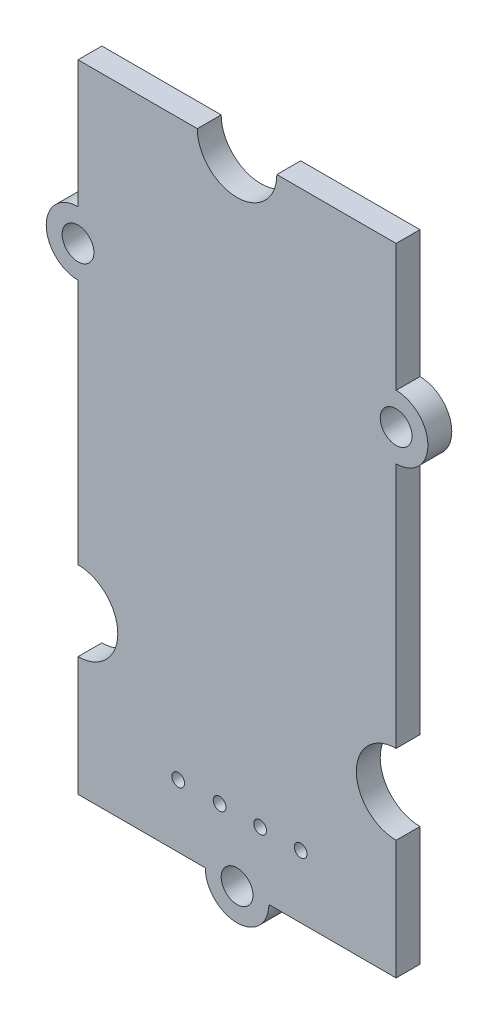
ISO-10303-21;
HEADER;
FILE_DESCRIPTION(('STEP AP214'),'2;1');
FILE_NAME('part.step','',(''),(''),'','','');
FILE_SCHEMA(('AUTOMOTIVE_DESIGN { 1 0 10303 214 1 1 1 1 }'));
ENDSEC;
DATA;
#1=APPLICATION_CONTEXT('core data for automotive mechanical design processes');
#2=APPLICATION_PROTOCOL_DEFINITION('international standard','automotive_design',2000,#1);
#3=PRODUCT_CONTEXT('',#1,'mechanical');
#4=PRODUCT('Part','Part','',(#3));
#5=PRODUCT_RELATED_PRODUCT_CATEGORY('part','',(#4));
#6=PRODUCT_DEFINITION_FORMATION('','',#4);
#7=PRODUCT_DEFINITION_CONTEXT('part definition',#1,'design');
#8=PRODUCT_DEFINITION('design','',#6,#7);
#9=PRODUCT_DEFINITION_SHAPE('','',#8);
#10=(LENGTH_UNIT() NAMED_UNIT(*) SI_UNIT(.MILLI.,.METRE.));
#11=(NAMED_UNIT(*) PLANE_ANGLE_UNIT() SI_UNIT($,.RADIAN.));
#12=(NAMED_UNIT(*) SI_UNIT($,.STERADIAN.) SOLID_ANGLE_UNIT());
#13=UNCERTAINTY_MEASURE_WITH_UNIT(LENGTH_MEASURE(1.E-05),#10,'distance_accuracy_value','');
#14=(GEOMETRIC_REPRESENTATION_CONTEXT(3) GLOBAL_UNCERTAINTY_ASSIGNED_CONTEXT((#13)) GLOBAL_UNIT_ASSIGNED_CONTEXT((#10,
#11,#12)) REPRESENTATION_CONTEXT('',''));
#15=CARTESIAN_POINT('',(0.,0.,0.));
#16=DIRECTION('',(0.,0.,1.));
#17=DIRECTION('',(1.,0.,0.));
#18=AXIS2_PLACEMENT_3D('',#15,#16,#17);
#19=CARTESIAN_POINT('',(-10.,0.,1.5));
#20=DIRECTION('',(1.,0.,0.));
#21=DIRECTION('',(0.,0.,-1.));
#22=AXIS2_PLACEMENT_3D('',#19,#20,#21);
#23=PLANE('',#22);
#24=DIRECTION('',(0.,-1.,0.));
#25=VECTOR('',#24,1.);
#26=CARTESIAN_POINT('',(-10.,0.,0.));
#27=LINE('',#26,#25);
#28=CARTESIAN_POINT('',(-10.,7.5,0.));
#29=VERTEX_POINT('',#28);
#30=CARTESIAN_POINT('',(-10.,0.,0.));
#31=VERTEX_POINT('',#30);
#32=EDGE_CURVE('E178',#29,#31,#27,.T.);
#33=ORIENTED_EDGE('',*,*,#32,.T.);
#34=DIRECTION('',(0.,0.,-1.));
#35=VECTOR('',#34,1.);
#36=CARTESIAN_POINT('',(-10.,0.,1.5));
#37=LINE('',#36,#35);
#38=CARTESIAN_POINT('',(-10.,0.,1.5));
#39=VERTEX_POINT('',#38);
#40=EDGE_CURVE('E11',#39,#31,#37,.T.);
#41=ORIENTED_EDGE('',*,*,#40,.F.);
#42=DIRECTION('',(0.,-1.,0.));
#43=VECTOR('',#42,1.);
#44=CARTESIAN_POINT('',(-10.,0.,1.5));
#45=LINE('',#44,#43);
#46=CARTESIAN_POINT('',(-10.,7.5,1.5));
#47=VERTEX_POINT('',#46);
#48=EDGE_CURVE('E209',#47,#39,#45,.T.);
#49=ORIENTED_EDGE('',*,*,#48,.F.);
#50=DIRECTION('',(0.,0.,-1.));
#51=VECTOR('',#50,1.);
#52=CARTESIAN_POINT('',(-10.,7.5,1.5));
#53=LINE('',#52,#51);
#54=EDGE_CURVE('E174',#47,#29,#53,.T.);
#55=ORIENTED_EDGE('',*,*,#54,.T.);
#56=EDGE_LOOP('',(#33,#41,#49,#55));
#57=FACE_BOUND('',#56,.T.);
#58=ADVANCED_FACE('F34',(#57),#23,.F.);
#59=CARTESIAN_POINT('',(-10.,0.,1.5));
#60=DIRECTION('',(0.,1.,0.));
#61=DIRECTION('',(0.,0.,1.));
#62=AXIS2_PLACEMENT_3D('',#59,#60,#61);
#63=PLANE('',#62);
#64=DIRECTION('',(1.,0.,0.));
#65=VECTOR('',#64,1.);
#66=CARTESIAN_POINT('',(-10.,0.,0.));
#67=LINE('',#66,#65);
#68=CARTESIAN_POINT('',(-2.,0.,0.));
#69=VERTEX_POINT('',#68);
#70=EDGE_CURVE('E181',#31,#69,#67,.T.);
#71=ORIENTED_EDGE('',*,*,#70,.T.);
#72=DIRECTION('',(0.,0.,-1.));
#73=VECTOR('',#72,1.);
#74=CARTESIAN_POINT('',(-2.,0.,1.5));
#75=LINE('',#74,#73);
#76=CARTESIAN_POINT('',(-2.,0.,1.5));
#77=VERTEX_POINT('',#76);
#78=EDGE_CURVE('E42',#77,#69,#75,.T.);
#79=ORIENTED_EDGE('',*,*,#78,.F.);
#80=DIRECTION('',(1.,0.,0.));
#81=VECTOR('',#80,1.);
#82=CARTESIAN_POINT('',(-10.,0.,1.5));
#83=LINE('',#82,#81);
#84=EDGE_CURVE('E117',#39,#77,#83,.T.);
#85=ORIENTED_EDGE('',*,*,#84,.F.);
#86=ORIENTED_EDGE('',*,*,#40,.T.);
#87=EDGE_LOOP('',(#71,#79,#85,#86));
#88=FACE_BOUND('',#87,.T.);
#89=ADVANCED_FACE('F308',(#88),#63,.F.);
#90=CARTESIAN_POINT('',(0.,0.,1.5));
#91=DIRECTION('',(0.,0.,-1.));
#92=DIRECTION('',(-1.,0.,0.));
#93=AXIS2_PLACEMENT_3D('',#90,#91,#92);
#94=CYLINDRICAL_SURFACE('',#93,2.);
#95=CARTESIAN_POINT('',(0.,0.,0.));
#96=DIRECTION('',(0.,0.,1.));
#97=DIRECTION('',(1.,0.,0.));
#98=AXIS2_PLACEMENT_3D('',#95,#96,#97);
#99=CIRCLE('',#98,2.);
#100=CARTESIAN_POINT('',(2.,0.,0.));
#101=VERTEX_POINT('',#100);
#102=EDGE_CURVE('E184',#69,#101,#99,.T.);
#103=ORIENTED_EDGE('',*,*,#102,.T.);
#104=DIRECTION('',(0.,0.,-1.));
#105=VECTOR('',#104,1.);
#106=CARTESIAN_POINT('',(2.,0.,1.5));
#107=LINE('',#106,#105);
#108=CARTESIAN_POINT('',(2.,0.,1.5));
#109=VERTEX_POINT('',#108);
#110=EDGE_CURVE('E240',#109,#101,#107,.T.);
#111=ORIENTED_EDGE('',*,*,#110,.F.);
#112=CARTESIAN_POINT('',(0.,0.,1.5));
#113=DIRECTION('',(0.,0.,1.));
#114=DIRECTION('',(1.,0.,0.));
#115=AXIS2_PLACEMENT_3D('',#112,#113,#114);
#116=CIRCLE('',#115,2.);
#117=EDGE_CURVE('E248',#77,#109,#116,.T.);
#118=ORIENTED_EDGE('',*,*,#117,.F.);
#119=ORIENTED_EDGE('',*,*,#78,.T.);
#120=EDGE_LOOP('',(#103,#111,#118,#119));
#121=FACE_BOUND('',#120,.T.);
#122=ADVANCED_FACE('F246',(#121),#94,.T.);
#123=CARTESIAN_POINT('',(10.,0.,1.5));
#124=DIRECTION('',(0.,1.,0.));
#125=DIRECTION('',(0.,0.,1.));
#126=AXIS2_PLACEMENT_3D('',#123,#124,#125);
#127=PLANE('',#126);
#128=DIRECTION('',(1.,0.,0.));
#129=VECTOR('',#128,1.);
#130=CARTESIAN_POINT('',(10.,0.,0.));
#131=LINE('',#130,#129);
#132=CARTESIAN_POINT('',(10.,0.,0.));
#133=VERTEX_POINT('',#132);
#134=EDGE_CURVE('E186',#101,#133,#131,.T.);
#135=ORIENTED_EDGE('',*,*,#134,.T.);
#136=DIRECTION('',(0.,0.,-1.));
#137=VECTOR('',#136,1.);
#138=CARTESIAN_POINT('',(10.,0.,1.5));
#139=LINE('',#138,#137);
#140=CARTESIAN_POINT('',(10.,0.,1.5));
#141=VERTEX_POINT('',#140);
#142=EDGE_CURVE('E237',#141,#133,#139,.T.);
#143=ORIENTED_EDGE('',*,*,#142,.F.);
#144=DIRECTION('',(1.,0.,0.));
#145=VECTOR('',#144,1.);
#146=CARTESIAN_POINT('',(10.,0.,1.5));
#147=LINE('',#146,#145);
#148=EDGE_CURVE('E266',#109,#141,#147,.T.);
#149=ORIENTED_EDGE('',*,*,#148,.F.);
#150=ORIENTED_EDGE('',*,*,#110,.T.);
#151=EDGE_LOOP('',(#135,#143,#149,#150));
#152=FACE_BOUND('',#151,.T.);
#153=ADVANCED_FACE('F257',(#152),#127,.F.);
#154=CARTESIAN_POINT('',(10.,0.,1.5));
#155=DIRECTION('',(-1.,0.,0.));
#156=DIRECTION('',(0.,0.,1.));
#157=AXIS2_PLACEMENT_3D('',#154,#155,#156);
#158=PLANE('',#157);
#159=DIRECTION('',(0.,1.,0.));
#160=VECTOR('',#159,1.);
#161=CARTESIAN_POINT('',(10.,0.,0.));
#162=LINE('',#161,#160);
#163=CARTESIAN_POINT('',(10.,7.5,0.));
#164=VERTEX_POINT('',#163);
#165=EDGE_CURVE('E188',#133,#164,#162,.T.);
#166=ORIENTED_EDGE('',*,*,#165,.T.);
#167=DIRECTION('',(0.,0.,-1.));
#168=VECTOR('',#167,1.);
#169=CARTESIAN_POINT('',(10.,7.5,1.5));
#170=LINE('',#169,#168);
#171=CARTESIAN_POINT('',(10.,7.5,1.5));
#172=VERTEX_POINT('',#171);
#173=EDGE_CURVE('E234',#172,#164,#170,.T.);
#174=ORIENTED_EDGE('',*,*,#173,.F.);
#175=DIRECTION('',(0.,1.,0.));
#176=VECTOR('',#175,1.);
#177=CARTESIAN_POINT('',(10.,0.,1.5));
#178=LINE('',#177,#176);
#179=EDGE_CURVE('E263',#141,#172,#178,.T.);
#180=ORIENTED_EDGE('',*,*,#179,.F.);
#181=ORIENTED_EDGE('',*,*,#142,.T.);
#182=EDGE_LOOP('',(#166,#174,#180,#181));
#183=FACE_BOUND('',#182,.T.);
#184=ADVANCED_FACE('F261',(#183),#158,.F.);
#185=CARTESIAN_POINT('',(10.,10.,1.5));
#186=DIRECTION('',(0.,0.,-1.));
#187=DIRECTION('',(-1.,0.,0.));
#188=AXIS2_PLACEMENT_3D('',#185,#186,#187);
#189=CYLINDRICAL_SURFACE('',#188,2.5);
#190=CARTESIAN_POINT('',(10.,10.,0.));
#191=DIRECTION('',(0.,0.,-1.));
#192=DIRECTION('',(1.,0.,0.));
#193=AXIS2_PLACEMENT_3D('',#190,#191,#192);
#194=CIRCLE('',#193,2.5);
#195=CARTESIAN_POINT('',(10.,12.5,0.));
#196=VERTEX_POINT('',#195);
#197=EDGE_CURVE('E190',#164,#196,#194,.T.);
#198=ORIENTED_EDGE('',*,*,#197,.T.);
#199=DIRECTION('',(0.,0.,-1.));
#200=VECTOR('',#199,1.);
#201=CARTESIAN_POINT('',(10.,12.5,1.5));
#202=LINE('',#201,#200);
#203=CARTESIAN_POINT('',(10.,12.5,1.5));
#204=VERTEX_POINT('',#203);
#205=EDGE_CURVE('E231',#204,#196,#202,.T.);
#206=ORIENTED_EDGE('',*,*,#205,.F.);
#207=CARTESIAN_POINT('',(10.,10.,1.5));
#208=DIRECTION('',(0.,0.,-1.));
#209=DIRECTION('',(1.,0.,0.));
#210=AXIS2_PLACEMENT_3D('',#207,#208,#209);
#211=CIRCLE('',#210,2.5);
#212=EDGE_CURVE('E265',#172,#204,#211,.T.);
#213=ORIENTED_EDGE('',*,*,#212,.F.);
#214=ORIENTED_EDGE('',*,*,#173,.T.);
#215=EDGE_LOOP('',(#198,#206,#213,#214));
#216=FACE_BOUND('',#215,.T.);
#217=ADVANCED_FACE('F321',(#216),#189,.F.);
#218=CARTESIAN_POINT('',(10.,12.5,1.5));
#219=DIRECTION('',(-1.,0.,0.));
#220=DIRECTION('',(0.,0.,1.));
#221=AXIS2_PLACEMENT_3D('',#218,#219,#220);
#222=PLANE('',#221);
#223=DIRECTION('',(0.,1.,0.));
#224=VECTOR('',#223,1.);
#225=CARTESIAN_POINT('',(10.,12.5,0.));
#226=LINE('',#225,#224);
#227=CARTESIAN_POINT('',(10.,28.,0.));
#228=VERTEX_POINT('',#227);
#229=EDGE_CURVE('E192',#196,#228,#226,.T.);
#230=ORIENTED_EDGE('',*,*,#229,.T.);
#231=DIRECTION('',(0.,0.,-1.));
#232=VECTOR('',#231,1.);
#233=CARTESIAN_POINT('',(10.,28.,1.5));
#234=LINE('',#233,#232);
#235=CARTESIAN_POINT('',(10.,28.,1.5));
#236=VERTEX_POINT('',#235);
#237=EDGE_CURVE('E228',#236,#228,#234,.T.);
#238=ORIENTED_EDGE('',*,*,#237,.F.);
#239=DIRECTION('',(0.,1.,0.));
#240=VECTOR('',#239,1.);
#241=CARTESIAN_POINT('',(10.,12.5,1.5));
#242=LINE('',#241,#240);
#243=EDGE_CURVE('E268',#204,#236,#242,.T.);
#244=ORIENTED_EDGE('',*,*,#243,.F.);
#245=ORIENTED_EDGE('',*,*,#205,.T.);
#246=EDGE_LOOP('',(#230,#238,#244,#245));
#247=FACE_BOUND('',#246,.T.);
#248=ADVANCED_FACE('F324',(#247),#222,.F.);
#249=CARTESIAN_POINT('',(10.,30.,1.5));
#250=DIRECTION('',(0.,0.,-1.));
#251=DIRECTION('',(-1.,0.,0.));
#252=AXIS2_PLACEMENT_3D('',#249,#250,#251);
#253=CYLINDRICAL_SURFACE('',#252,2.);
#254=CARTESIAN_POINT('',(10.,30.,0.));
#255=DIRECTION('',(0.,0.,1.));
#256=DIRECTION('',(-1.,0.,0.));
#257=AXIS2_PLACEMENT_3D('',#254,#255,#256);
#258=CIRCLE('',#257,2.);
#259=CARTESIAN_POINT('',(10.,32.,0.));
#260=VERTEX_POINT('',#259);
#261=EDGE_CURVE('E194',#228,#260,#258,.T.);
#262=ORIENTED_EDGE('',*,*,#261,.T.);
#263=DIRECTION('',(0.,0.,-1.));
#264=VECTOR('',#263,1.);
#265=CARTESIAN_POINT('',(10.,32.,1.5));
#266=LINE('',#265,#264);
#267=CARTESIAN_POINT('',(10.,32.,1.5));
#268=VERTEX_POINT('',#267);
#269=EDGE_CURVE('E225',#268,#260,#266,.T.);
#270=ORIENTED_EDGE('',*,*,#269,.F.);
#271=CARTESIAN_POINT('',(10.,30.,1.5));
#272=DIRECTION('',(0.,0.,1.));
#273=DIRECTION('',(-1.,0.,0.));
#274=AXIS2_PLACEMENT_3D('',#271,#272,#273);
#275=CIRCLE('',#274,2.);
#276=EDGE_CURVE('E274',#236,#268,#275,.T.);
#277=ORIENTED_EDGE('',*,*,#276,.F.);
#278=ORIENTED_EDGE('',*,*,#237,.T.);
#279=EDGE_LOOP('',(#262,#270,#277,#278));
#280=FACE_BOUND('',#279,.T.);
#281=ADVANCED_FACE('F328',(#280),#253,.T.);
#282=CARTESIAN_POINT('',(10.,40.,1.5));
#283=DIRECTION('',(-1.,0.,0.));
#284=DIRECTION('',(0.,0.,1.));
#285=AXIS2_PLACEMENT_3D('',#282,#283,#284);
#286=PLANE('',#285);
#287=DIRECTION('',(0.,1.,0.));
#288=VECTOR('',#287,1.);
#289=CARTESIAN_POINT('',(10.,40.,0.));
#290=LINE('',#289,#288);
#291=CARTESIAN_POINT('',(10.,40.,0.));
#292=VERTEX_POINT('',#291);
#293=EDGE_CURVE('E196',#260,#292,#290,.T.);
#294=ORIENTED_EDGE('',*,*,#293,.T.);
#295=DIRECTION('',(0.,0.,-1.));
#296=VECTOR('',#295,1.);
#297=CARTESIAN_POINT('',(10.,40.,1.5));
#298=LINE('',#297,#296);
#299=CARTESIAN_POINT('',(10.,40.,1.5));
#300=VERTEX_POINT('',#299);
#301=EDGE_CURVE('E222',#300,#292,#298,.T.);
#302=ORIENTED_EDGE('',*,*,#301,.F.);
#303=DIRECTION('',(0.,1.,0.));
#304=VECTOR('',#303,1.);
#305=CARTESIAN_POINT('',(10.,40.,1.5));
#306=LINE('',#305,#304);
#307=EDGE_CURVE('E276',#268,#300,#306,.T.);
#308=ORIENTED_EDGE('',*,*,#307,.F.);
#309=ORIENTED_EDGE('',*,*,#269,.T.);
#310=EDGE_LOOP('',(#294,#302,#308,#309));
#311=FACE_BOUND('',#310,.T.);
#312=ADVANCED_FACE('F332',(#311),#286,.F.);
#313=CARTESIAN_POINT('',(10.,40.,1.5));
#314=DIRECTION('',(0.,-1.,0.));
#315=DIRECTION('',(0.,0.,-1.));
#316=AXIS2_PLACEMENT_3D('',#313,#314,#315);
#317=PLANE('',#316);
#318=DIRECTION('',(-1.,0.,0.));
#319=VECTOR('',#318,1.);
#320=CARTESIAN_POINT('',(10.,40.,0.));
#321=LINE('',#320,#319);
#322=CARTESIAN_POINT('',(2.5,40.,0.));
#323=VERTEX_POINT('',#322);
#324=EDGE_CURVE('E198',#292,#323,#321,.T.);
#325=ORIENTED_EDGE('',*,*,#324,.T.);
#326=DIRECTION('',(0.,0.,-1.));
#327=VECTOR('',#326,1.);
#328=CARTESIAN_POINT('',(2.5,40.,1.5));
#329=LINE('',#328,#327);
#330=CARTESIAN_POINT('',(2.5,40.,1.5));
#331=VERTEX_POINT('',#330);
#332=EDGE_CURVE('E219',#331,#323,#329,.T.);
#333=ORIENTED_EDGE('',*,*,#332,.F.);
#334=DIRECTION('',(-1.,0.,0.));
#335=VECTOR('',#334,1.);
#336=CARTESIAN_POINT('',(10.,40.,1.5));
#337=LINE('',#336,#335);
#338=EDGE_CURVE('E278',#300,#331,#337,.T.);
#339=ORIENTED_EDGE('',*,*,#338,.F.);
#340=ORIENTED_EDGE('',*,*,#301,.T.);
#341=EDGE_LOOP('',(#325,#333,#339,#340));
#342=FACE_BOUND('',#341,.T.);
#343=ADVANCED_FACE('F336',(#342),#317,.F.);
#344=CARTESIAN_POINT('',(0.,40.,1.5));
#345=DIRECTION('',(0.,0.,-1.));
#346=DIRECTION('',(-1.,0.,0.));
#347=AXIS2_PLACEMENT_3D('',#344,#345,#346);
#348=CYLINDRICAL_SURFACE('',#347,2.5);
#349=CARTESIAN_POINT('',(0.,40.,0.));
#350=DIRECTION('',(0.,0.,-1.));
#351=DIRECTION('',(1.,0.,0.));
#352=AXIS2_PLACEMENT_3D('',#349,#350,#351);
#353=CIRCLE('',#352,2.5);
#354=CARTESIAN_POINT('',(-2.5,40.,0.));
#355=VERTEX_POINT('',#354);
#356=EDGE_CURVE('E200',#323,#355,#353,.T.);
#357=ORIENTED_EDGE('',*,*,#356,.T.);
#358=DIRECTION('',(0.,0.,-1.));
#359=VECTOR('',#358,1.);
#360=CARTESIAN_POINT('',(-2.5,40.,1.5));
#361=LINE('',#360,#359);
#362=CARTESIAN_POINT('',(-2.5,40.,1.5));
#363=VERTEX_POINT('',#362);
#364=EDGE_CURVE('E216',#363,#355,#361,.T.);
#365=ORIENTED_EDGE('',*,*,#364,.F.);
#366=CARTESIAN_POINT('',(0.,40.,1.5));
#367=DIRECTION('',(0.,0.,-1.));
#368=DIRECTION('',(1.,0.,0.));
#369=AXIS2_PLACEMENT_3D('',#366,#367,#368);
#370=CIRCLE('',#369,2.5);
#371=EDGE_CURVE('E280',#331,#363,#370,.T.);
#372=ORIENTED_EDGE('',*,*,#371,.F.);
#373=ORIENTED_EDGE('',*,*,#332,.T.);
#374=EDGE_LOOP('',(#357,#365,#372,#373));
#375=FACE_BOUND('',#374,.T.);
#376=ADVANCED_FACE('F340',(#375),#348,.F.);
#377=CARTESIAN_POINT('',(-10.,40.,1.5));
#378=DIRECTION('',(0.,-1.,0.));
#379=DIRECTION('',(0.,0.,-1.));
#380=AXIS2_PLACEMENT_3D('',#377,#378,#379);
#381=PLANE('',#380);
#382=DIRECTION('',(-1.,0.,0.));
#383=VECTOR('',#382,1.);
#384=CARTESIAN_POINT('',(-10.,40.,0.));
#385=LINE('',#384,#383);
#386=CARTESIAN_POINT('',(-10.,40.,0.));
#387=VERTEX_POINT('',#386);
#388=EDGE_CURVE('E202',#355,#387,#385,.T.);
#389=ORIENTED_EDGE('',*,*,#388,.T.);
#390=DIRECTION('',(0.,0.,-1.));
#391=VECTOR('',#390,1.);
#392=CARTESIAN_POINT('',(-10.,40.,1.5));
#393=LINE('',#392,#391);
#394=CARTESIAN_POINT('',(-10.,40.,1.5));
#395=VERTEX_POINT('',#394);
#396=EDGE_CURVE('E213',#395,#387,#393,.T.);
#397=ORIENTED_EDGE('',*,*,#396,.F.);
#398=DIRECTION('',(-1.,0.,0.));
#399=VECTOR('',#398,1.);
#400=CARTESIAN_POINT('',(-10.,40.,1.5));
#401=LINE('',#400,#399);
#402=EDGE_CURVE('E282',#363,#395,#401,.T.);
#403=ORIENTED_EDGE('',*,*,#402,.F.);
#404=ORIENTED_EDGE('',*,*,#364,.T.);
#405=EDGE_LOOP('',(#389,#397,#403,#404));
#406=FACE_BOUND('',#405,.T.);
#407=ADVANCED_FACE('F288',(#406),#381,.F.);
#408=CARTESIAN_POINT('',(-10.,40.,1.5));
#409=DIRECTION('',(1.,0.,0.));
#410=DIRECTION('',(0.,0.,-1.));
#411=AXIS2_PLACEMENT_3D('',#408,#409,#410);
#412=PLANE('',#411);
#413=DIRECTION('',(0.,-1.,0.));
#414=VECTOR('',#413,1.);
#415=CARTESIAN_POINT('',(-10.,40.,0.));
#416=LINE('',#415,#414);
#417=CARTESIAN_POINT('',(-10.,32.,0.));
#418=VERTEX_POINT('',#417);
#419=EDGE_CURVE('E204',#387,#418,#416,.T.);
#420=ORIENTED_EDGE('',*,*,#419,.T.);
#421=DIRECTION('',(0.,0.,-1.));
#422=VECTOR('',#421,1.);
#423=CARTESIAN_POINT('',(-10.,32.,1.5));
#424=LINE('',#423,#422);
#425=CARTESIAN_POINT('',(-10.,32.,1.5));
#426=VERTEX_POINT('',#425);
#427=EDGE_CURVE('E169',#426,#418,#424,.T.);
#428=ORIENTED_EDGE('',*,*,#427,.F.);
#429=DIRECTION('',(0.,-1.,0.));
#430=VECTOR('',#429,1.);
#431=CARTESIAN_POINT('',(-10.,40.,1.5));
#432=LINE('',#431,#430);
#433=EDGE_CURVE('E160',#395,#426,#432,.T.);
#434=ORIENTED_EDGE('',*,*,#433,.F.);
#435=ORIENTED_EDGE('',*,*,#396,.T.);
#436=EDGE_LOOP('',(#420,#428,#434,#435));
#437=FACE_BOUND('',#436,.T.);
#438=ADVANCED_FACE('F292',(#437),#412,.F.);
#439=CARTESIAN_POINT('',(-10.,30.,1.5));
#440=DIRECTION('',(0.,0.,-1.));
#441=DIRECTION('',(-1.,0.,0.));
#442=AXIS2_PLACEMENT_3D('',#439,#440,#441);
#443=CYLINDRICAL_SURFACE('',#442,2.);
#444=CARTESIAN_POINT('',(-10.,30.,0.));
#445=DIRECTION('',(0.,0.,1.));
#446=DIRECTION('',(1.,0.,0.));
#447=AXIS2_PLACEMENT_3D('',#444,#445,#446);
#448=CIRCLE('',#447,2.);
#449=CARTESIAN_POINT('',(-10.,28.,0.));
#450=VERTEX_POINT('',#449);
#451=EDGE_CURVE('E168',#418,#450,#448,.T.);
#452=ORIENTED_EDGE('',*,*,#451,.T.);
#453=DIRECTION('',(0.,0.,-1.));
#454=VECTOR('',#453,1.);
#455=CARTESIAN_POINT('',(-10.,28.,1.5));
#456=LINE('',#455,#454);
#457=CARTESIAN_POINT('',(-10.,28.,1.5));
#458=VERTEX_POINT('',#457);
#459=EDGE_CURVE('E165',#458,#450,#456,.T.);
#460=ORIENTED_EDGE('',*,*,#459,.F.);
#461=CARTESIAN_POINT('',(-10.,30.,1.5));
#462=DIRECTION('',(0.,0.,1.));
#463=DIRECTION('',(1.,0.,0.));
#464=AXIS2_PLACEMENT_3D('',#461,#462,#463);
#465=CIRCLE('',#464,2.);
#466=EDGE_CURVE('E154',#426,#458,#465,.T.);
#467=ORIENTED_EDGE('',*,*,#466,.F.);
#468=ORIENTED_EDGE('',*,*,#427,.T.);
#469=EDGE_LOOP('',(#452,#460,#467,#468));
#470=FACE_BOUND('',#469,.T.);
#471=ADVANCED_FACE('F166',(#470),#443,.T.);
#472=CARTESIAN_POINT('',(-10.,12.5,1.5));
#473=DIRECTION('',(1.,0.,0.));
#474=DIRECTION('',(0.,0.,-1.));
#475=AXIS2_PLACEMENT_3D('',#472,#473,#474);
#476=PLANE('',#475);
#477=DIRECTION('',(0.,-1.,0.));
#478=VECTOR('',#477,1.);
#479=CARTESIAN_POINT('',(-10.,12.5,0.));
#480=LINE('',#479,#478);
#481=CARTESIAN_POINT('',(-10.,12.5,0.));
#482=VERTEX_POINT('',#481);
#483=EDGE_CURVE('E103',#450,#482,#480,.T.);
#484=ORIENTED_EDGE('',*,*,#483,.T.);
#485=DIRECTION('',(0.,0.,-1.));
#486=VECTOR('',#485,1.);
#487=CARTESIAN_POINT('',(-10.,12.5,1.5));
#488=LINE('',#487,#486);
#489=CARTESIAN_POINT('',(-10.,12.5,1.5));
#490=VERTEX_POINT('',#489);
#491=EDGE_CURVE('E170',#490,#482,#488,.T.);
#492=ORIENTED_EDGE('',*,*,#491,.F.);
#493=DIRECTION('',(0.,-1.,0.));
#494=VECTOR('',#493,1.);
#495=CARTESIAN_POINT('',(-10.,12.5,1.5));
#496=LINE('',#495,#494);
#497=EDGE_CURVE('E158',#458,#490,#496,.T.);
#498=ORIENTED_EDGE('',*,*,#497,.F.);
#499=ORIENTED_EDGE('',*,*,#459,.T.);
#500=EDGE_LOOP('',(#484,#492,#498,#499));
#501=FACE_BOUND('',#500,.T.);
#502=ADVANCED_FACE('F172',(#501),#476,.F.);
#503=CARTESIAN_POINT('',(-10.,10.,1.5));
#504=DIRECTION('',(0.,0.,-1.));
#505=DIRECTION('',(-1.,0.,0.));
#506=AXIS2_PLACEMENT_3D('',#503,#504,#505);
#507=CYLINDRICAL_SURFACE('',#506,2.5);
#508=CARTESIAN_POINT('',(-10.,10.,0.));
#509=DIRECTION('',(0.,0.,-1.));
#510=DIRECTION('',(-1.,0.,0.));
#511=AXIS2_PLACEMENT_3D('',#508,#509,#510);
#512=CIRCLE('',#511,2.5);
#513=EDGE_CURVE('E109',#482,#29,#512,.T.);
#514=ORIENTED_EDGE('',*,*,#513,.T.);
#515=ORIENTED_EDGE('',*,*,#54,.F.);
#516=CARTESIAN_POINT('',(-10.,10.,1.5));
#517=DIRECTION('',(0.,0.,-1.));
#518=DIRECTION('',(-1.,0.,0.));
#519=AXIS2_PLACEMENT_3D('',#516,#517,#518);
#520=CIRCLE('',#519,2.5);
#521=EDGE_CURVE('E50',#490,#47,#520,.T.);
#522=ORIENTED_EDGE('',*,*,#521,.F.);
#523=ORIENTED_EDGE('',*,*,#491,.T.);
#524=EDGE_LOOP('',(#514,#515,#522,#523));
#525=FACE_BOUND('',#524,.T.);
#526=ADVANCED_FACE('F296',(#525),#507,.F.);
#527=CARTESIAN_POINT('',(-10.,10.,1.5));
#528=DIRECTION('',(0.,0.,-1.));
#529=DIRECTION('',(-1.,0.,0.));
#530=AXIS2_PLACEMENT_3D('',#527,#528,#529);
#531=PLANE('',#530);
#532=CARTESIAN_POINT('',(-3.7,3.94341720128032,1.5));
#533=DIRECTION('',(0.,0.,1.));
#534=DIRECTION('',(1.,0.,0.));
#535=AXIS2_PLACEMENT_3D('',#532,#533,#534);
#536=CIRCLE('',#535,0.4);
#537=CARTESIAN_POINT('',(-3.3,3.94341720128032,1.5));
#538=VERTEX_POINT('',#537);
#539=EDGE_CURVE('E458',#538,#538,#536,.T.);
#540=ORIENTED_EDGE('',*,*,#539,.F.);
#541=EDGE_LOOP('',(#540));
#542=FACE_BOUND('',#541,.T.);
#543=CARTESIAN_POINT('',(-1.1,3.94341720128032,1.5));
#544=DIRECTION('',(0.,0.,1.));
#545=DIRECTION('',(1.,0.,0.));
#546=AXIS2_PLACEMENT_3D('',#543,#544,#545);
#547=CIRCLE('',#546,0.4);
#548=CARTESIAN_POINT('',(-0.699999999999996,3.94341720128032,1.5));
#549=VERTEX_POINT('',#548);
#550=EDGE_CURVE('E460',#549,#549,#547,.T.);
#551=ORIENTED_EDGE('',*,*,#550,.F.);
#552=EDGE_LOOP('',(#551));
#553=FACE_BOUND('',#552,.T.);
#554=CARTESIAN_POINT('',(1.45,3.94341720128032,1.5));
#555=DIRECTION('',(0.,0.,1.));
#556=DIRECTION('',(1.,0.,0.));
#557=AXIS2_PLACEMENT_3D('',#554,#555,#556);
#558=CIRCLE('',#557,0.4);
#559=CARTESIAN_POINT('',(1.85,3.94341720128032,1.5));
#560=VERTEX_POINT('',#559);
#561=EDGE_CURVE('E466',#560,#560,#558,.T.);
#562=ORIENTED_EDGE('',*,*,#561,.F.);
#563=EDGE_LOOP('',(#562));
#564=FACE_BOUND('',#563,.T.);
#565=CARTESIAN_POINT('',(4.,3.94341720128032,1.5));
#566=DIRECTION('',(0.,0.,1.));
#567=DIRECTION('',(1.,0.,0.));
#568=AXIS2_PLACEMENT_3D('',#565,#566,#567);
#569=CIRCLE('',#568,0.4);
#570=CARTESIAN_POINT('',(4.4,3.94341720128032,1.5));
#571=VERTEX_POINT('',#570);
#572=EDGE_CURVE('E472',#571,#571,#569,.T.);
#573=ORIENTED_EDGE('',*,*,#572,.F.);
#574=EDGE_LOOP('',(#573));
#575=FACE_BOUND('',#574,.T.);
#576=CARTESIAN_POINT('',(0.,0.,1.5));
#577=DIRECTION('',(0.,0.,1.));
#578=DIRECTION('',(1.,0.,0.));
#579=AXIS2_PLACEMENT_3D('',#576,#577,#578);
#580=CIRCLE('',#579,1.);
#581=CARTESIAN_POINT('',(1.,0.,1.5));
#582=VERTEX_POINT('',#581);
#583=EDGE_CURVE('E478',#582,#582,#580,.T.);
#584=ORIENTED_EDGE('',*,*,#583,.F.);
#585=EDGE_LOOP('',(#584));
#586=FACE_BOUND('',#585,.T.);
#587=CARTESIAN_POINT('',(10.,30.,1.5));
#588=DIRECTION('',(0.,0.,1.));
#589=DIRECTION('',(-1.,0.,0.));
#590=AXIS2_PLACEMENT_3D('',#587,#588,#589);
#591=CIRCLE('',#590,1.);
#592=CARTESIAN_POINT('',(9.,30.,1.5));
#593=VERTEX_POINT('',#592);
#594=EDGE_CURVE('E484',#593,#593,#591,.T.);
#595=ORIENTED_EDGE('',*,*,#594,.F.);
#596=EDGE_LOOP('',(#595));
#597=FACE_BOUND('',#596,.T.);
#598=CARTESIAN_POINT('',(-10.,30.,1.5));
#599=DIRECTION('',(0.,0.,1.));
#600=DIRECTION('',(1.,0.,0.));
#601=AXIS2_PLACEMENT_3D('',#598,#599,#600);
#602=CIRCLE('',#601,1.);
#603=CARTESIAN_POINT('',(-9.,30.,1.5));
#604=VERTEX_POINT('',#603);
#605=EDGE_CURVE('E490',#604,#604,#602,.T.);
#606=ORIENTED_EDGE('',*,*,#605,.F.);
#607=EDGE_LOOP('',(#606));
#608=FACE_BOUND('',#607,.T.);
#609=ORIENTED_EDGE('',*,*,#48,.T.);
#610=ORIENTED_EDGE('',*,*,#84,.T.);
#611=ORIENTED_EDGE('',*,*,#117,.T.);
#612=ORIENTED_EDGE('',*,*,#148,.T.);
#613=ORIENTED_EDGE('',*,*,#179,.T.);
#614=ORIENTED_EDGE('',*,*,#212,.T.);
#615=ORIENTED_EDGE('',*,*,#243,.T.);
#616=ORIENTED_EDGE('',*,*,#276,.T.);
#617=ORIENTED_EDGE('',*,*,#307,.T.);
#618=ORIENTED_EDGE('',*,*,#338,.T.);
#619=ORIENTED_EDGE('',*,*,#371,.T.);
#620=ORIENTED_EDGE('',*,*,#402,.T.);
#621=ORIENTED_EDGE('',*,*,#433,.T.);
#622=ORIENTED_EDGE('',*,*,#466,.T.);
#623=ORIENTED_EDGE('',*,*,#497,.T.);
#624=ORIENTED_EDGE('',*,*,#521,.T.);
#625=EDGE_LOOP('',(#609,#610,#611,#612,#613,#614,#615,#616,#617,#618,#619,#620,#621,#622,#623,#624));
#626=FACE_BOUND('',#625,.T.);
#627=ADVANCED_FACE('F156',(#542,#553,#564,#575,#586,#597,#608,#626),#531,.F.);
#628=CARTESIAN_POINT('',(-10.,10.,0.));
#629=DIRECTION('',(0.,0.,-1.));
#630=DIRECTION('',(-1.,0.,0.));
#631=AXIS2_PLACEMENT_3D('',#628,#629,#630);
#632=PLANE('',#631);
#633=CARTESIAN_POINT('',(-3.7,3.94341720128032,0.));
#634=DIRECTION('',(0.,0.,1.));
#635=DIRECTION('',(1.,0.,0.));
#636=AXIS2_PLACEMENT_3D('',#633,#634,#635);
#637=CIRCLE('',#636,0.4);
#638=CARTESIAN_POINT('',(-3.3,3.94341720128032,0.));
#639=VERTEX_POINT('',#638);
#640=EDGE_CURVE('E455',#639,#639,#637,.T.);
#641=ORIENTED_EDGE('',*,*,#640,.T.);
#642=EDGE_LOOP('',(#641));
#643=FACE_BOUND('',#642,.T.);
#644=CARTESIAN_POINT('',(-1.1,3.94341720128032,0.));
#645=DIRECTION('',(0.,0.,1.));
#646=DIRECTION('',(1.,0.,0.));
#647=AXIS2_PLACEMENT_3D('',#644,#645,#646);
#648=CIRCLE('',#647,0.4);
#649=CARTESIAN_POINT('',(-0.699999999999996,3.94341720128032,0.));
#650=VERTEX_POINT('',#649);
#651=EDGE_CURVE('E463',#650,#650,#648,.T.);
#652=ORIENTED_EDGE('',*,*,#651,.T.);
#653=EDGE_LOOP('',(#652));
#654=FACE_BOUND('',#653,.T.);
#655=CARTESIAN_POINT('',(1.45,3.94341720128032,0.));
#656=DIRECTION('',(0.,0.,1.));
#657=DIRECTION('',(1.,0.,0.));
#658=AXIS2_PLACEMENT_3D('',#655,#656,#657);
#659=CIRCLE('',#658,0.4);
#660=CARTESIAN_POINT('',(1.85,3.94341720128032,0.));
#661=VERTEX_POINT('',#660);
#662=EDGE_CURVE('E469',#661,#661,#659,.T.);
#663=ORIENTED_EDGE('',*,*,#662,.T.);
#664=EDGE_LOOP('',(#663));
#665=FACE_BOUND('',#664,.T.);
#666=CARTESIAN_POINT('',(4.,3.94341720128032,0.));
#667=DIRECTION('',(0.,0.,1.));
#668=DIRECTION('',(1.,0.,0.));
#669=AXIS2_PLACEMENT_3D('',#666,#667,#668);
#670=CIRCLE('',#669,0.4);
#671=CARTESIAN_POINT('',(4.4,3.94341720128032,0.));
#672=VERTEX_POINT('',#671);
#673=EDGE_CURVE('E475',#672,#672,#670,.T.);
#674=ORIENTED_EDGE('',*,*,#673,.T.);
#675=EDGE_LOOP('',(#674));
#676=FACE_BOUND('',#675,.T.);
#677=CARTESIAN_POINT('',(0.,0.,0.));
#678=DIRECTION('',(0.,0.,1.));
#679=DIRECTION('',(1.,0.,0.));
#680=AXIS2_PLACEMENT_3D('',#677,#678,#679);
#681=CIRCLE('',#680,1.);
#682=CARTESIAN_POINT('',(1.,0.,0.));
#683=VERTEX_POINT('',#682);
#684=EDGE_CURVE('E481',#683,#683,#681,.T.);
#685=ORIENTED_EDGE('',*,*,#684,.T.);
#686=EDGE_LOOP('',(#685));
#687=FACE_BOUND('',#686,.T.);
#688=CARTESIAN_POINT('',(10.,30.,0.));
#689=DIRECTION('',(0.,0.,1.));
#690=DIRECTION('',(-1.,0.,0.));
#691=AXIS2_PLACEMENT_3D('',#688,#689,#690);
#692=CIRCLE('',#691,1.);
#693=CARTESIAN_POINT('',(9.,30.,0.));
#694=VERTEX_POINT('',#693);
#695=EDGE_CURVE('E487',#694,#694,#692,.T.);
#696=ORIENTED_EDGE('',*,*,#695,.T.);
#697=EDGE_LOOP('',(#696));
#698=FACE_BOUND('',#697,.T.);
#699=CARTESIAN_POINT('',(-10.,30.,0.));
#700=DIRECTION('',(0.,0.,1.));
#701=DIRECTION('',(1.,0.,0.));
#702=AXIS2_PLACEMENT_3D('',#699,#700,#701);
#703=CIRCLE('',#702,1.);
#704=CARTESIAN_POINT('',(-9.,30.,0.));
#705=VERTEX_POINT('',#704);
#706=EDGE_CURVE('E182',#705,#705,#703,.T.);
#707=ORIENTED_EDGE('',*,*,#706,.T.);
#708=EDGE_LOOP('',(#707));
#709=FACE_BOUND('',#708,.T.);
#710=ORIENTED_EDGE('',*,*,#32,.F.);
#711=ORIENTED_EDGE('',*,*,#513,.F.);
#712=ORIENTED_EDGE('',*,*,#483,.F.);
#713=ORIENTED_EDGE('',*,*,#451,.F.);
#714=ORIENTED_EDGE('',*,*,#419,.F.);
#715=ORIENTED_EDGE('',*,*,#388,.F.);
#716=ORIENTED_EDGE('',*,*,#356,.F.);
#717=ORIENTED_EDGE('',*,*,#324,.F.);
#718=ORIENTED_EDGE('',*,*,#293,.F.);
#719=ORIENTED_EDGE('',*,*,#261,.F.);
#720=ORIENTED_EDGE('',*,*,#229,.F.);
#721=ORIENTED_EDGE('',*,*,#197,.F.);
#722=ORIENTED_EDGE('',*,*,#165,.F.);
#723=ORIENTED_EDGE('',*,*,#134,.F.);
#724=ORIENTED_EDGE('',*,*,#102,.F.);
#725=ORIENTED_EDGE('',*,*,#70,.F.);
#726=EDGE_LOOP('',(#710,#711,#712,#713,#714,#715,#716,#717,#718,#719,#720,#721,#722,#723,#724,#725));
#727=FACE_BOUND('',#726,.T.);
#728=ADVANCED_FACE('F252',(#643,#654,#665,#676,#687,#698,#709,#727),#632,.T.);
#729=CARTESIAN_POINT('',(-10.,30.,0.));
#730=DIRECTION('',(0.,0.,1.));
#731=DIRECTION('',(1.,0.,0.));
#732=AXIS2_PLACEMENT_3D('',#729,#730,#731);
#733=CYLINDRICAL_SURFACE('',#732,1.);
#734=ORIENTED_EDGE('',*,*,#706,.F.);
#735=EDGE_LOOP('',(#734));
#736=FACE_BOUND('',#735,.T.);
#737=ORIENTED_EDGE('',*,*,#605,.T.);
#738=EDGE_LOOP('',(#737));
#739=FACE_BOUND('',#738,.T.);
#740=ADVANCED_FACE('F379',(#736,#739),#733,.F.);
#741=CARTESIAN_POINT('',(10.,30.,0.));
#742=DIRECTION('',(0.,0.,1.));
#743=DIRECTION('',(1.,0.,0.));
#744=AXIS2_PLACEMENT_3D('',#741,#742,#743);
#745=CYLINDRICAL_SURFACE('',#744,1.);
#746=ORIENTED_EDGE('',*,*,#695,.F.);
#747=EDGE_LOOP('',(#746));
#748=FACE_BOUND('',#747,.T.);
#749=ORIENTED_EDGE('',*,*,#594,.T.);
#750=EDGE_LOOP('',(#749));
#751=FACE_BOUND('',#750,.T.);
#752=ADVANCED_FACE('F388',(#748,#751),#745,.F.);
#753=CARTESIAN_POINT('',(0.,0.,0.));
#754=DIRECTION('',(0.,0.,1.));
#755=DIRECTION('',(1.,0.,0.));
#756=AXIS2_PLACEMENT_3D('',#753,#754,#755);
#757=CYLINDRICAL_SURFACE('',#756,1.);
#758=ORIENTED_EDGE('',*,*,#684,.F.);
#759=EDGE_LOOP('',(#758));
#760=FACE_BOUND('',#759,.T.);
#761=ORIENTED_EDGE('',*,*,#583,.T.);
#762=EDGE_LOOP('',(#761));
#763=FACE_BOUND('',#762,.T.);
#764=ADVANCED_FACE('F398',(#760,#763),#757,.F.);
#765=CARTESIAN_POINT('',(4.,3.94341720128032,0.));
#766=DIRECTION('',(0.,0.,1.));
#767=DIRECTION('',(1.,0.,0.));
#768=AXIS2_PLACEMENT_3D('',#765,#766,#767);
#769=CYLINDRICAL_SURFACE('',#768,0.4);
#770=ORIENTED_EDGE('',*,*,#673,.F.);
#771=EDGE_LOOP('',(#770));
#772=FACE_BOUND('',#771,.T.);
#773=ORIENTED_EDGE('',*,*,#572,.T.);
#774=EDGE_LOOP('',(#773));
#775=FACE_BOUND('',#774,.T.);
#776=ADVANCED_FACE('F408',(#772,#775),#769,.F.);
#777=CARTESIAN_POINT('',(1.45,3.94341720128032,0.));
#778=DIRECTION('',(0.,0.,1.));
#779=DIRECTION('',(1.,0.,0.));
#780=AXIS2_PLACEMENT_3D('',#777,#778,#779);
#781=CYLINDRICAL_SURFACE('',#780,0.4);
#782=ORIENTED_EDGE('',*,*,#662,.F.);
#783=EDGE_LOOP('',(#782));
#784=FACE_BOUND('',#783,.T.);
#785=ORIENTED_EDGE('',*,*,#561,.T.);
#786=EDGE_LOOP('',(#785));
#787=FACE_BOUND('',#786,.T.);
#788=ADVANCED_FACE('F418',(#784,#787),#781,.F.);
#789=CARTESIAN_POINT('',(-1.1,3.94341720128032,0.));
#790=DIRECTION('',(0.,0.,1.));
#791=DIRECTION('',(1.,0.,0.));
#792=AXIS2_PLACEMENT_3D('',#789,#790,#791);
#793=CYLINDRICAL_SURFACE('',#792,0.4);
#794=ORIENTED_EDGE('',*,*,#651,.F.);
#795=EDGE_LOOP('',(#794));
#796=FACE_BOUND('',#795,.T.);
#797=ORIENTED_EDGE('',*,*,#550,.T.);
#798=EDGE_LOOP('',(#797));
#799=FACE_BOUND('',#798,.T.);
#800=ADVANCED_FACE('F428',(#796,#799),#793,.F.);
#801=CARTESIAN_POINT('',(-3.7,3.94341720128032,0.));
#802=DIRECTION('',(0.,0.,1.));
#803=DIRECTION('',(1.,0.,0.));
#804=AXIS2_PLACEMENT_3D('',#801,#802,#803);
#805=CYLINDRICAL_SURFACE('',#804,0.4);
#806=ORIENTED_EDGE('',*,*,#640,.F.);
#807=EDGE_LOOP('',(#806));
#808=FACE_BOUND('',#807,.T.);
#809=ORIENTED_EDGE('',*,*,#539,.T.);
#810=EDGE_LOOP('',(#809));
#811=FACE_BOUND('',#810,.T.);
#812=ADVANCED_FACE('F438',(#808,#811),#805,.F.);
#813=CLOSED_SHELL('',(#58,#89,#122,#153,#184,#217,#248,#281,#312,#343,#376,#407,#438,#471,#502,
#526,#627,#728,#740,#752,#764,#776,#788,#800,#812));
#814=MANIFOLD_SOLID_BREP('B2',#813);
#815=ADVANCED_BREP_SHAPE_REPRESENTATION('',(#18,#814),#14);
#816=SHAPE_DEFINITION_REPRESENTATION(#9,#815);
ENDSEC;
END-ISO-10303-21;
